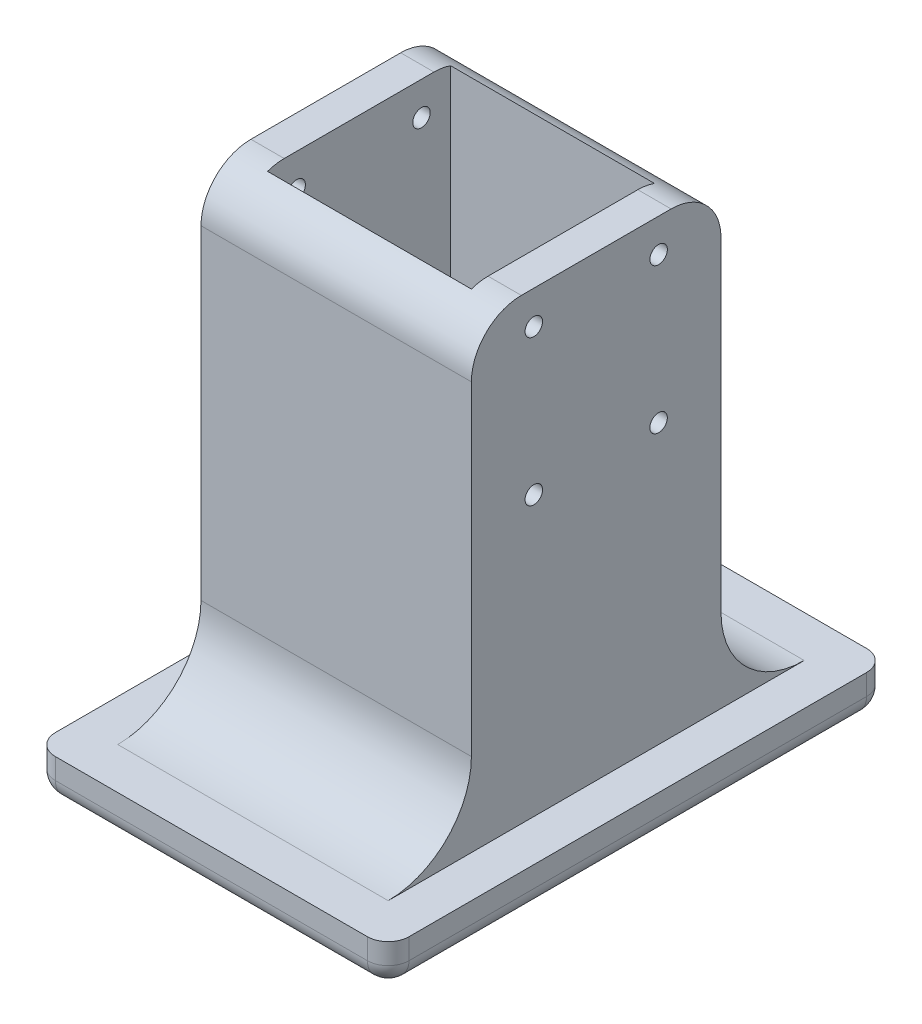
ISO-10303-21;
HEADER;
FILE_DESCRIPTION(('STEP AP214'),'2;1');
FILE_NAME('part.step','',(''),(''),'','','');
FILE_SCHEMA(('AUTOMOTIVE_DESIGN { 1 0 10303 214 1 1 1 1 }'));
ENDSEC;
DATA;
#1=APPLICATION_CONTEXT('core data for automotive mechanical design processes');
#2=APPLICATION_PROTOCOL_DEFINITION('international standard','automotive_design',2000,#1);
#3=PRODUCT_CONTEXT('',#1,'mechanical');
#4=PRODUCT('Part','Part','',(#3));
#5=PRODUCT_RELATED_PRODUCT_CATEGORY('part','',(#4));
#6=PRODUCT_DEFINITION_FORMATION('','',#4);
#7=PRODUCT_DEFINITION_CONTEXT('part definition',#1,'design');
#8=PRODUCT_DEFINITION('design','',#6,#7);
#9=PRODUCT_DEFINITION_SHAPE('','',#8);
#10=(LENGTH_UNIT() NAMED_UNIT(*) SI_UNIT(.MILLI.,.METRE.));
#11=(NAMED_UNIT(*) PLANE_ANGLE_UNIT() SI_UNIT($,.RADIAN.));
#12=(NAMED_UNIT(*) SI_UNIT($,.STERADIAN.) SOLID_ANGLE_UNIT());
#13=UNCERTAINTY_MEASURE_WITH_UNIT(LENGTH_MEASURE(1.E-05),#10,'distance_accuracy_value','');
#14=(GEOMETRIC_REPRESENTATION_CONTEXT(3) GLOBAL_UNCERTAINTY_ASSIGNED_CONTEXT((#13)) GLOBAL_UNIT_ASSIGNED_CONTEXT((#10,
#11,#12)) REPRESENTATION_CONTEXT('',''));
#15=CARTESIAN_POINT('',(0.,0.,0.));
#16=DIRECTION('',(0.,0.,1.));
#17=DIRECTION('',(1.,0.,0.));
#18=AXIS2_PLACEMENT_3D('',#15,#16,#17);
#19=CARTESIAN_POINT('',(0.,120.,0.));
#20=DIRECTION('',(0.,1.,0.));
#21=DIRECTION('',(0.,0.,1.));
#22=AXIS2_PLACEMENT_3D('',#19,#20,#21);
#23=PLANE('',#22);
#24=DIRECTION('',(0.,0.,1.));
#25=VECTOR('',#24,1.);
#26=CARTESIAN_POINT('',(-32.5,120.,30.));
#27=LINE('',#26,#25);
#28=CARTESIAN_POINT('',(-32.5,120.,-18.));
#29=VERTEX_POINT('',#28);
#30=CARTESIAN_POINT('',(-32.5,120.,18.));
#31=VERTEX_POINT('',#30);
#32=EDGE_CURVE('E239',#29,#31,#27,.T.);
#33=ORIENTED_EDGE('',*,*,#32,.T.);
#34=DIRECTION('',(1.,0.,0.));
#35=VECTOR('',#34,1.);
#36=CARTESIAN_POINT('',(32.5,120.,18.));
#37=LINE('',#36,#35);
#38=CARTESIAN_POINT('',(-24.5,120.,18.));
#39=VERTEX_POINT('',#38);
#40=EDGE_CURVE('E356',#31,#39,#37,.T.);
#41=ORIENTED_EDGE('',*,*,#40,.T.);
#42=DIRECTION('',(0.,0.,1.));
#43=VECTOR('',#42,1.);
#44=CARTESIAN_POINT('',(-24.5,120.,22.));
#45=LINE('',#44,#43);
#46=CARTESIAN_POINT('',(-24.5,120.,-18.));
#47=VERTEX_POINT('',#46);
#48=EDGE_CURVE('E227',#47,#39,#45,.T.);
#49=ORIENTED_EDGE('',*,*,#48,.F.);
#50=DIRECTION('',(-1.,0.,0.));
#51=VECTOR('',#50,1.);
#52=CARTESIAN_POINT('',(-32.5,120.,-18.));
#53=LINE('',#52,#51);
#54=EDGE_CURVE('E313',#47,#29,#53,.T.);
#55=ORIENTED_EDGE('',*,*,#54,.T.);
#56=EDGE_LOOP('',(#33,#41,#49,#55));
#57=FACE_BOUND('',#56,.T.);
#58=ADVANCED_FACE('F41',(#57),#23,.T.);
#59=CARTESIAN_POINT('',(0.,10.,0.));
#60=DIRECTION('',(0.,1.,0.));
#61=DIRECTION('',(0.,0.,1.));
#62=AXIS2_PLACEMENT_3D('',#59,#60,#61);
#63=PLANE('',#62);
#64=DIRECTION('',(1.,0.,0.));
#65=VECTOR('',#64,1.);
#66=CARTESIAN_POINT('',(42.5,10.,60.));
#67=LINE('',#66,#65);
#68=CARTESIAN_POINT('',(-37.5,10.,60.));
#69=VERTEX_POINT('',#68);
#70=CARTESIAN_POINT('',(37.5,10.,60.));
#71=VERTEX_POINT('',#70);
#72=EDGE_CURVE('E262',#69,#71,#67,.T.);
#73=ORIENTED_EDGE('',*,*,#72,.T.);
#74=CARTESIAN_POINT('',(37.5,10.,55.));
#75=DIRECTION('',(0.,1.,0.));
#76=DIRECTION('',(0.,0.,1.));
#77=AXIS2_PLACEMENT_3D('',#74,#75,#76);
#78=CIRCLE('',#77,5.);
#79=CARTESIAN_POINT('',(42.5,10.,55.));
#80=VERTEX_POINT('',#79);
#81=EDGE_CURVE('E311',#71,#80,#78,.T.);
#82=ORIENTED_EDGE('',*,*,#81,.T.);
#83=DIRECTION('',(0.,0.,-1.));
#84=VECTOR('',#83,1.);
#85=CARTESIAN_POINT('',(42.5,10.,60.));
#86=LINE('',#85,#84);
#87=CARTESIAN_POINT('',(42.5,10.,-55.));
#88=VERTEX_POINT('',#87);
#89=EDGE_CURVE('E265',#80,#88,#86,.T.);
#90=ORIENTED_EDGE('',*,*,#89,.T.);
#91=CARTESIAN_POINT('',(37.5,10.,-55.));
#92=DIRECTION('',(0.,1.,0.));
#93=DIRECTION('',(0.,0.,1.));
#94=AXIS2_PLACEMENT_3D('',#91,#92,#93);
#95=CIRCLE('',#94,5.);
#96=CARTESIAN_POINT('',(37.5,10.,-60.));
#97=VERTEX_POINT('',#96);
#98=EDGE_CURVE('E305',#88,#97,#95,.T.);
#99=ORIENTED_EDGE('',*,*,#98,.T.);
#100=DIRECTION('',(-1.,0.,0.));
#101=VECTOR('',#100,1.);
#102=CARTESIAN_POINT('',(42.5,10.,-60.));
#103=LINE('',#102,#101);
#104=CARTESIAN_POINT('',(-37.5,10.,-60.));
#105=VERTEX_POINT('',#104);
#106=EDGE_CURVE('E268',#97,#105,#103,.T.);
#107=ORIENTED_EDGE('',*,*,#106,.T.);
#108=CARTESIAN_POINT('',(-37.5,10.,-55.));
#109=DIRECTION('',(0.,1.,0.));
#110=DIRECTION('',(0.,0.,1.));
#111=AXIS2_PLACEMENT_3D('',#108,#109,#110);
#112=CIRCLE('',#111,5.);
#113=CARTESIAN_POINT('',(-42.5,10.,-55.));
#114=VERTEX_POINT('',#113);
#115=EDGE_CURVE('E307',#105,#114,#112,.T.);
#116=ORIENTED_EDGE('',*,*,#115,.T.);
#117=DIRECTION('',(0.,0.,1.));
#118=VECTOR('',#117,1.);
#119=CARTESIAN_POINT('',(-42.5,10.,60.));
#120=LINE('',#119,#118);
#121=CARTESIAN_POINT('',(-42.5,10.,55.));
#122=VERTEX_POINT('',#121);
#123=EDGE_CURVE('E259',#114,#122,#120,.T.);
#124=ORIENTED_EDGE('',*,*,#123,.T.);
#125=CARTESIAN_POINT('',(-37.5,10.,55.));
#126=DIRECTION('',(0.,1.,0.));
#127=DIRECTION('',(0.,0.,1.));
#128=AXIS2_PLACEMENT_3D('',#125,#126,#127);
#129=CIRCLE('',#128,5.);
#130=EDGE_CURVE('E309',#122,#69,#129,.T.);
#131=ORIENTED_EDGE('',*,*,#130,.T.);
#132=EDGE_LOOP('',(#73,#82,#90,#99,#107,#116,#124,#131));
#133=FACE_BOUND('',#132,.T.);
#134=DIRECTION('',(0.,0.,1.));
#135=VECTOR('',#134,1.);
#136=CARTESIAN_POINT('',(-32.5,10.,30.));
#137=LINE('',#136,#135);
#138=CARTESIAN_POINT('',(-32.5,10.,-50.));
#139=VERTEX_POINT('',#138);
#140=CARTESIAN_POINT('',(-32.5,10.,50.));
#141=VERTEX_POINT('',#140);
#142=EDGE_CURVE('E238',#139,#141,#137,.T.);
#143=ORIENTED_EDGE('',*,*,#142,.F.);
#144=DIRECTION('',(-1.,0.,0.));
#145=VECTOR('',#144,1.);
#146=CARTESIAN_POINT('',(0.,10.,-50.));
#147=LINE('',#146,#145);
#148=CARTESIAN_POINT('',(32.5,10.,-50.));
#149=VERTEX_POINT('',#148);
#150=EDGE_CURVE('E407',#139,#149,#147,.F.);
#151=ORIENTED_EDGE('',*,*,#150,.T.);
#152=DIRECTION('',(0.,0.,-1.));
#153=VECTOR('',#152,1.);
#154=CARTESIAN_POINT('',(32.5,10.,30.));
#155=LINE('',#154,#153);
#156=CARTESIAN_POINT('',(32.5,10.,50.));
#157=VERTEX_POINT('',#156);
#158=EDGE_CURVE('E243',#157,#149,#155,.T.);
#159=ORIENTED_EDGE('',*,*,#158,.F.);
#160=DIRECTION('',(1.,0.,0.));
#161=VECTOR('',#160,1.);
#162=CARTESIAN_POINT('',(0.,10.,50.));
#163=LINE('',#162,#161);
#164=EDGE_CURVE('E404',#157,#141,#163,.F.);
#165=ORIENTED_EDGE('',*,*,#164,.T.);
#166=EDGE_LOOP('',(#143,#151,#159,#165));
#167=FACE_BOUND('',#166,.T.);
#168=ADVANCED_FACE('F421',(#133,#167),#63,.T.);
#169=CARTESIAN_POINT('',(-42.5,10.,60.));
#170=DIRECTION('',(1.,0.,0.));
#171=DIRECTION('',(0.,0.,-1.));
#172=AXIS2_PLACEMENT_3D('',#169,#170,#171);
#173=PLANE('',#172);
#174=DIRECTION('',(0.,0.,1.));
#175=VECTOR('',#174,1.);
#176=CARTESIAN_POINT('',(-42.5,5.,60.));
#177=LINE('',#176,#175);
#178=CARTESIAN_POINT('',(-42.5,5.,-55.));
#179=VERTEX_POINT('',#178);
#180=CARTESIAN_POINT('',(-42.5,5.,55.));
#181=VERTEX_POINT('',#180);
#182=EDGE_CURVE('E301',#179,#181,#177,.T.);
#183=ORIENTED_EDGE('',*,*,#182,.T.);
#184=DIRECTION('',(0.,-1.,0.));
#185=VECTOR('',#184,1.);
#186=CARTESIAN_POINT('',(-42.5,10.,55.));
#187=LINE('',#186,#185);
#188=EDGE_CURVE('E303',#181,#122,#187,.F.);
#189=ORIENTED_EDGE('',*,*,#188,.T.);
#190=ORIENTED_EDGE('',*,*,#123,.F.);
#191=DIRECTION('',(0.,-1.,0.));
#192=VECTOR('',#191,1.);
#193=CARTESIAN_POINT('',(-42.5,10.,-55.));
#194=LINE('',#193,#192);
#195=EDGE_CURVE('E299',#114,#179,#194,.T.);
#196=ORIENTED_EDGE('',*,*,#195,.T.);
#197=EDGE_LOOP('',(#183,#189,#190,#196));
#198=FACE_BOUND('',#197,.T.);
#199=ADVANCED_FACE('F513',(#198),#173,.F.);
#200=CARTESIAN_POINT('',(42.5,10.,60.));
#201=DIRECTION('',(0.,0.,-1.));
#202=DIRECTION('',(-1.,0.,0.));
#203=AXIS2_PLACEMENT_3D('',#200,#201,#202);
#204=PLANE('',#203);
#205=DIRECTION('',(1.,0.,0.));
#206=VECTOR('',#205,1.);
#207=CARTESIAN_POINT('',(42.5,5.,60.));
#208=LINE('',#207,#206);
#209=CARTESIAN_POINT('',(-37.5,5.,60.));
#210=VERTEX_POINT('',#209);
#211=CARTESIAN_POINT('',(37.5,5.,60.));
#212=VERTEX_POINT('',#211);
#213=EDGE_CURVE('E273',#210,#212,#208,.T.);
#214=ORIENTED_EDGE('',*,*,#213,.T.);
#215=DIRECTION('',(0.,-1.,0.));
#216=VECTOR('',#215,1.);
#217=CARTESIAN_POINT('',(37.5,10.,60.));
#218=LINE('',#217,#216);
#219=EDGE_CURVE('E276',#212,#71,#218,.F.);
#220=ORIENTED_EDGE('',*,*,#219,.T.);
#221=ORIENTED_EDGE('',*,*,#72,.F.);
#222=DIRECTION('',(0.,-1.,0.));
#223=VECTOR('',#222,1.);
#224=CARTESIAN_POINT('',(-37.5,10.,60.));
#225=LINE('',#224,#223);
#226=EDGE_CURVE('E271',#69,#210,#225,.T.);
#227=ORIENTED_EDGE('',*,*,#226,.T.);
#228=EDGE_LOOP('',(#214,#220,#221,#227));
#229=FACE_BOUND('',#228,.T.);
#230=ADVANCED_FACE('F536',(#229),#204,.F.);
#231=CARTESIAN_POINT('',(42.5,10.,60.));
#232=DIRECTION('',(-1.,0.,0.));
#233=DIRECTION('',(0.,0.,1.));
#234=AXIS2_PLACEMENT_3D('',#231,#232,#233);
#235=PLANE('',#234);
#236=ORIENTED_EDGE('',*,*,#89,.F.);
#237=DIRECTION('',(0.,-1.,0.));
#238=VECTOR('',#237,1.);
#239=CARTESIAN_POINT('',(42.5,10.,55.));
#240=LINE('',#239,#238);
#241=CARTESIAN_POINT('',(42.5,5.,55.));
#242=VERTEX_POINT('',#241);
#243=EDGE_CURVE('E291',#80,#242,#240,.T.);
#244=ORIENTED_EDGE('',*,*,#243,.T.);
#245=DIRECTION('',(0.,0.,-1.));
#246=VECTOR('',#245,1.);
#247=CARTESIAN_POINT('',(42.5,5.,60.));
#248=LINE('',#247,#246);
#249=CARTESIAN_POINT('',(42.5,5.,-55.));
#250=VERTEX_POINT('',#249);
#251=EDGE_CURVE('E289',#242,#250,#248,.T.);
#252=ORIENTED_EDGE('',*,*,#251,.T.);
#253=DIRECTION('',(0.,-1.,0.));
#254=VECTOR('',#253,1.);
#255=CARTESIAN_POINT('',(42.5,10.,-55.));
#256=LINE('',#255,#254);
#257=EDGE_CURVE('E287',#250,#88,#256,.F.);
#258=ORIENTED_EDGE('',*,*,#257,.T.);
#259=EDGE_LOOP('',(#236,#244,#252,#258));
#260=FACE_BOUND('',#259,.T.);
#261=ADVANCED_FACE('F530',(#260),#235,.F.);
#262=CARTESIAN_POINT('',(42.5,10.,-60.));
#263=DIRECTION('',(0.,0.,1.));
#264=DIRECTION('',(1.,0.,0.));
#265=AXIS2_PLACEMENT_3D('',#262,#263,#264);
#266=PLANE('',#265);
#267=DIRECTION('',(-1.,0.,0.));
#268=VECTOR('',#267,1.);
#269=CARTESIAN_POINT('',(42.5,5.,-60.));
#270=LINE('',#269,#268);
#271=CARTESIAN_POINT('',(37.5,5.,-60.));
#272=VERTEX_POINT('',#271);
#273=CARTESIAN_POINT('',(-37.5,5.,-60.));
#274=VERTEX_POINT('',#273);
#275=EDGE_CURVE('E295',#272,#274,#270,.T.);
#276=ORIENTED_EDGE('',*,*,#275,.T.);
#277=DIRECTION('',(0.,-1.,0.));
#278=VECTOR('',#277,1.);
#279=CARTESIAN_POINT('',(-37.5,10.,-60.));
#280=LINE('',#279,#278);
#281=EDGE_CURVE('E297',#274,#105,#280,.F.);
#282=ORIENTED_EDGE('',*,*,#281,.T.);
#283=ORIENTED_EDGE('',*,*,#106,.F.);
#284=DIRECTION('',(0.,-1.,0.));
#285=VECTOR('',#284,1.);
#286=CARTESIAN_POINT('',(37.5,10.,-60.));
#287=LINE('',#286,#285);
#288=EDGE_CURVE('E293',#97,#272,#287,.T.);
#289=ORIENTED_EDGE('',*,*,#288,.T.);
#290=EDGE_LOOP('',(#276,#282,#283,#289));
#291=FACE_BOUND('',#290,.T.);
#292=ADVANCED_FACE('F524',(#291),#266,.F.);
#293=CARTESIAN_POINT('',(0.,0.,0.));
#294=DIRECTION('',(0.,1.,0.));
#295=DIRECTION('',(0.,0.,1.));
#296=AXIS2_PLACEMENT_3D('',#293,#294,#295);
#297=PLANE('',#296);
#298=DIRECTION('',(0.,0.,-1.));
#299=VECTOR('',#298,1.);
#300=CARTESIAN_POINT('',(37.5,0.,0.));
#301=LINE('',#300,#299);
#302=CARTESIAN_POINT('',(37.5,0.,-55.));
#303=VERTEX_POINT('',#302);
#304=CARTESIAN_POINT('',(37.5,0.,55.));
#305=VERTEX_POINT('',#304);
#306=EDGE_CURVE('E282',#303,#305,#301,.F.);
#307=ORIENTED_EDGE('',*,*,#306,.T.);
#308=DIRECTION('',(1.,0.,0.));
#309=VECTOR('',#308,1.);
#310=CARTESIAN_POINT('',(0.,0.,55.));
#311=LINE('',#310,#309);
#312=CARTESIAN_POINT('',(-37.5,0.,55.));
#313=VERTEX_POINT('',#312);
#314=EDGE_CURVE('E284',#305,#313,#311,.F.);
#315=ORIENTED_EDGE('',*,*,#314,.T.);
#316=DIRECTION('',(0.,0.,1.));
#317=VECTOR('',#316,1.);
#318=CARTESIAN_POINT('',(-37.5,0.,0.));
#319=LINE('',#318,#317);
#320=CARTESIAN_POINT('',(-37.5,0.,-55.));
#321=VERTEX_POINT('',#320);
#322=EDGE_CURVE('E278',#313,#321,#319,.F.);
#323=ORIENTED_EDGE('',*,*,#322,.T.);
#324=DIRECTION('',(-1.,0.,0.));
#325=VECTOR('',#324,1.);
#326=CARTESIAN_POINT('',(0.,0.,-55.));
#327=LINE('',#326,#325);
#328=EDGE_CURVE('E280',#321,#303,#327,.F.);
#329=ORIENTED_EDGE('',*,*,#328,.T.);
#330=EDGE_LOOP('',(#307,#315,#323,#329));
#331=FACE_BOUND('',#330,.T.);
#332=ADVANCED_FACE('F517',(#331),#297,.F.);
#333=DIRECTION('',(0.,0.,-1.));
#334=VECTOR('',#333,1.);
#335=CARTESIAN_POINT('',(24.5,120.,22.));
#336=LINE('',#335,#334);
#337=CARTESIAN_POINT('',(24.5,120.,18.));
#338=VERTEX_POINT('',#337);
#339=CARTESIAN_POINT('',(24.5,120.,-18.));
#340=VERTEX_POINT('',#339);
#341=EDGE_CURVE('E230',#338,#340,#336,.T.);
#342=ORIENTED_EDGE('',*,*,#341,.F.);
#343=DIRECTION('',(1.,0.,0.));
#344=VECTOR('',#343,1.);
#345=CARTESIAN_POINT('',(32.5,120.,18.));
#346=LINE('',#345,#344);
#347=CARTESIAN_POINT('',(32.5,120.,18.));
#348=VERTEX_POINT('',#347);
#349=EDGE_CURVE('E354',#338,#348,#346,.T.);
#350=ORIENTED_EDGE('',*,*,#349,.T.);
#351=DIRECTION('',(0.,0.,-1.));
#352=VECTOR('',#351,1.);
#353=CARTESIAN_POINT('',(32.5,120.,30.));
#354=LINE('',#353,#352);
#355=CARTESIAN_POINT('',(32.5,120.,-18.));
#356=VERTEX_POINT('',#355);
#357=EDGE_CURVE('E242',#348,#356,#354,.T.);
#358=ORIENTED_EDGE('',*,*,#357,.T.);
#359=DIRECTION('',(-1.,0.,0.));
#360=VECTOR('',#359,1.);
#361=CARTESIAN_POINT('',(-32.5,120.,-18.));
#362=LINE('',#361,#360);
#363=EDGE_CURVE('E351',#356,#340,#362,.T.);
#364=ORIENTED_EDGE('',*,*,#363,.T.);
#365=EDGE_LOOP('',(#342,#350,#358,#364));
#366=FACE_BOUND('',#365,.T.);
#367=ADVANCED_FACE('F441',(#366),#23,.T.);
#368=CARTESIAN_POINT('',(-32.5,120.,30.));
#369=DIRECTION('',(1.,0.,0.));
#370=DIRECTION('',(0.,0.,-1.));
#371=AXIS2_PLACEMENT_3D('',#368,#369,#370);
#372=PLANE('',#371);
#373=CARTESIAN_POINT('',(-32.5,77.,15.));
#374=DIRECTION('',(1.,0.,0.));
#375=DIRECTION('',(0.,0.,-1.));
#376=AXIS2_PLACEMENT_3D('',#373,#374,#375);
#377=CIRCLE('',#376,2.1);
#378=CARTESIAN_POINT('',(-32.5,77.,12.9));
#379=VERTEX_POINT('',#378);
#380=EDGE_CURVE('E317',#379,#379,#377,.T.);
#381=ORIENTED_EDGE('',*,*,#380,.T.);
#382=EDGE_LOOP('',(#381));
#383=FACE_BOUND('',#382,.T.);
#384=CARTESIAN_POINT('',(-32.5,77.,-15.));
#385=DIRECTION('',(1.,0.,0.));
#386=DIRECTION('',(0.,0.,-1.));
#387=AXIS2_PLACEMENT_3D('',#384,#385,#386);
#388=CIRCLE('',#387,2.1);
#389=CARTESIAN_POINT('',(-32.5,77.,-17.1));
#390=VERTEX_POINT('',#389);
#391=EDGE_CURVE('E401',#390,#390,#388,.T.);
#392=ORIENTED_EDGE('',*,*,#391,.T.);
#393=EDGE_LOOP('',(#392));
#394=FACE_BOUND('',#393,.T.);
#395=CARTESIAN_POINT('',(-32.5,112.,-15.));
#396=DIRECTION('',(1.,0.,0.));
#397=DIRECTION('',(0.,0.,-1.));
#398=AXIS2_PLACEMENT_3D('',#395,#396,#397);
#399=CIRCLE('',#398,2.1);
#400=CARTESIAN_POINT('',(-32.5,112.,-17.1));
#401=VERTEX_POINT('',#400);
#402=EDGE_CURVE('E396',#401,#401,#399,.T.);
#403=ORIENTED_EDGE('',*,*,#402,.T.);
#404=EDGE_LOOP('',(#403));
#405=FACE_BOUND('',#404,.T.);
#406=CARTESIAN_POINT('',(-32.5,112.,15.));
#407=DIRECTION('',(1.,0.,0.));
#408=DIRECTION('',(0.,0.,-1.));
#409=AXIS2_PLACEMENT_3D('',#406,#407,#408);
#410=CIRCLE('',#409,2.1);
#411=CARTESIAN_POINT('',(-32.5,112.,12.9));
#412=VERTEX_POINT('',#411);
#413=EDGE_CURVE('E391',#412,#412,#410,.T.);
#414=ORIENTED_EDGE('',*,*,#413,.T.);
#415=EDGE_LOOP('',(#414));
#416=FACE_BOUND('',#415,.T.);
#417=DIRECTION('',(0.,-1.,0.));
#418=VECTOR('',#417,1.);
#419=CARTESIAN_POINT('',(-32.5,120.,30.));
#420=LINE('',#419,#418);
#421=CARTESIAN_POINT('',(-32.5,108.,30.));
#422=VERTEX_POINT('',#421);
#423=CARTESIAN_POINT('',(-32.5,30.,30.));
#424=VERTEX_POINT('',#423);
#425=EDGE_CURVE('E257',#422,#424,#420,.T.);
#426=ORIENTED_EDGE('',*,*,#425,.F.);
#427=CARTESIAN_POINT('',(-32.5,108.,18.));
#428=DIRECTION('',(1.,0.,0.));
#429=DIRECTION('',(0.,0.,-1.));
#430=AXIS2_PLACEMENT_3D('',#427,#428,#429);
#431=CIRCLE('',#430,12.);
#432=EDGE_CURVE('E376',#422,#31,#431,.F.);
#433=ORIENTED_EDGE('',*,*,#432,.T.);
#434=ORIENTED_EDGE('',*,*,#32,.F.);
#435=CARTESIAN_POINT('',(-32.5,108.,-18.));
#436=DIRECTION('',(1.,0.,0.));
#437=DIRECTION('',(0.,0.,-1.));
#438=AXIS2_PLACEMENT_3D('',#435,#436,#437);
#439=CIRCLE('',#438,12.);
#440=CARTESIAN_POINT('',(-32.5,108.,-30.));
#441=VERTEX_POINT('',#440);
#442=EDGE_CURVE('E374',#29,#441,#439,.F.);
#443=ORIENTED_EDGE('',*,*,#442,.T.);
#444=DIRECTION('',(0.,-1.,0.));
#445=VECTOR('',#444,1.);
#446=CARTESIAN_POINT('',(-32.5,120.,-30.));
#447=LINE('',#446,#445);
#448=CARTESIAN_POINT('',(-32.5,30.,-30.));
#449=VERTEX_POINT('',#448);
#450=EDGE_CURVE('E246',#441,#449,#447,.T.);
#451=ORIENTED_EDGE('',*,*,#450,.T.);
#452=CARTESIAN_POINT('',(-32.5,30.,-50.));
#453=DIRECTION('',(1.,0.,0.));
#454=DIRECTION('',(0.,0.,-1.));
#455=AXIS2_PLACEMENT_3D('',#452,#453,#454);
#456=CIRCLE('',#455,20.);
#457=EDGE_CURVE('E412',#449,#139,#456,.T.);
#458=ORIENTED_EDGE('',*,*,#457,.T.);
#459=ORIENTED_EDGE('',*,*,#142,.T.);
#460=CARTESIAN_POINT('',(-32.5,30.,50.));
#461=DIRECTION('',(1.,0.,0.));
#462=DIRECTION('',(0.,0.,-1.));
#463=AXIS2_PLACEMENT_3D('',#460,#461,#462);
#464=CIRCLE('',#463,20.);
#465=EDGE_CURVE('E11',#141,#424,#464,.T.);
#466=ORIENTED_EDGE('',*,*,#465,.T.);
#467=EDGE_LOOP('',(#426,#433,#434,#443,#451,#458,#459,#466));
#468=FACE_BOUND('',#467,.T.);
#469=ADVANCED_FACE('F451',(#383,#394,#405,#416,#468),#372,.F.);
#470=CARTESIAN_POINT('',(32.5,120.,30.));
#471=DIRECTION('',(0.,0.,-1.));
#472=DIRECTION('',(-1.,0.,0.));
#473=AXIS2_PLACEMENT_3D('',#470,#471,#472);
#474=PLANE('',#473);
#475=ORIENTED_EDGE('',*,*,#425,.T.);
#476=DIRECTION('',(1.,0.,0.));
#477=VECTOR('',#476,1.);
#478=CARTESIAN_POINT('',(32.5,30.,30.));
#479=LINE('',#478,#477);
#480=CARTESIAN_POINT('',(32.5,30.,30.));
#481=VERTEX_POINT('',#480);
#482=EDGE_CURVE('E410',#424,#481,#479,.T.);
#483=ORIENTED_EDGE('',*,*,#482,.T.);
#484=DIRECTION('',(0.,-1.,0.));
#485=VECTOR('',#484,1.);
#486=CARTESIAN_POINT('',(32.5,120.,30.));
#487=LINE('',#486,#485);
#488=CARTESIAN_POINT('',(32.5,108.,30.));
#489=VERTEX_POINT('',#488);
#490=EDGE_CURVE('E254',#489,#481,#487,.T.);
#491=ORIENTED_EDGE('',*,*,#490,.F.);
#492=DIRECTION('',(1.,0.,0.));
#493=VECTOR('',#492,1.);
#494=CARTESIAN_POINT('',(-32.5,108.,30.));
#495=LINE('',#494,#493);
#496=EDGE_CURVE('E372',#489,#422,#495,.F.);
#497=ORIENTED_EDGE('',*,*,#496,.T.);
#498=EDGE_LOOP('',(#475,#483,#491,#497));
#499=FACE_BOUND('',#498,.T.);
#500=ADVANCED_FACE('F450',(#499),#474,.F.);
#501=CARTESIAN_POINT('',(32.5,120.,30.));
#502=DIRECTION('',(-1.,0.,0.));
#503=DIRECTION('',(0.,0.,1.));
#504=AXIS2_PLACEMENT_3D('',#501,#502,#503);
#505=PLANE('',#504);
#506=CARTESIAN_POINT('',(32.5,77.,15.));
#507=DIRECTION('',(-1.,0.,0.));
#508=DIRECTION('',(0.,0.,1.));
#509=AXIS2_PLACEMENT_3D('',#506,#507,#508);
#510=CIRCLE('',#509,2.1);
#511=CARTESIAN_POINT('',(32.5,77.,17.1));
#512=VERTEX_POINT('',#511);
#513=EDGE_CURVE('E465',#512,#512,#510,.T.);
#514=ORIENTED_EDGE('',*,*,#513,.T.);
#515=EDGE_LOOP('',(#514));
#516=FACE_BOUND('',#515,.T.);
#517=CARTESIAN_POINT('',(32.5,77.,-15.));
#518=DIRECTION('',(-1.,0.,0.));
#519=DIRECTION('',(0.,0.,1.));
#520=AXIS2_PLACEMENT_3D('',#517,#518,#519);
#521=CIRCLE('',#520,2.1);
#522=CARTESIAN_POINT('',(32.5,77.,-12.9));
#523=VERTEX_POINT('',#522);
#524=EDGE_CURVE('E472',#523,#523,#521,.T.);
#525=ORIENTED_EDGE('',*,*,#524,.T.);
#526=EDGE_LOOP('',(#525));
#527=FACE_BOUND('',#526,.T.);
#528=CARTESIAN_POINT('',(32.5,112.,-15.));
#529=DIRECTION('',(-1.,0.,0.));
#530=DIRECTION('',(0.,0.,1.));
#531=AXIS2_PLACEMENT_3D('',#528,#529,#530);
#532=CIRCLE('',#531,2.1);
#533=CARTESIAN_POINT('',(32.5,112.,-12.9));
#534=VERTEX_POINT('',#533);
#535=EDGE_CURVE('E479',#534,#534,#532,.T.);
#536=ORIENTED_EDGE('',*,*,#535,.T.);
#537=EDGE_LOOP('',(#536));
#538=FACE_BOUND('',#537,.T.);
#539=CARTESIAN_POINT('',(32.5,112.,15.));
#540=DIRECTION('',(-1.,0.,0.));
#541=DIRECTION('',(0.,0.,1.));
#542=AXIS2_PLACEMENT_3D('',#539,#540,#541);
#543=CIRCLE('',#542,2.1);
#544=CARTESIAN_POINT('',(32.5,112.,17.1));
#545=VERTEX_POINT('',#544);
#546=EDGE_CURVE('E486',#545,#545,#543,.T.);
#547=ORIENTED_EDGE('',*,*,#546,.T.);
#548=EDGE_LOOP('',(#547));
#549=FACE_BOUND('',#548,.T.);
#550=ORIENTED_EDGE('',*,*,#357,.F.);
#551=CARTESIAN_POINT('',(32.5,108.,18.));
#552=DIRECTION('',(-1.,0.,0.));
#553=DIRECTION('',(0.,0.,1.));
#554=AXIS2_PLACEMENT_3D('',#551,#552,#553);
#555=CIRCLE('',#554,12.);
#556=EDGE_CURVE('E370',#348,#489,#555,.F.);
#557=ORIENTED_EDGE('',*,*,#556,.T.);
#558=ORIENTED_EDGE('',*,*,#490,.T.);
#559=CARTESIAN_POINT('',(32.5,30.,50.));
#560=DIRECTION('',(-1.,0.,0.));
#561=DIRECTION('',(0.,0.,1.));
#562=AXIS2_PLACEMENT_3D('',#559,#560,#561);
#563=CIRCLE('',#562,20.);
#564=EDGE_CURVE('E49',#481,#157,#563,.T.);
#565=ORIENTED_EDGE('',*,*,#564,.T.);
#566=ORIENTED_EDGE('',*,*,#158,.T.);
#567=CARTESIAN_POINT('',(32.5,30.,-50.));
#568=DIRECTION('',(-1.,0.,0.));
#569=DIRECTION('',(0.,0.,1.));
#570=AXIS2_PLACEMENT_3D('',#567,#568,#569);
#571=CIRCLE('',#570,20.);
#572=CARTESIAN_POINT('',(32.5,30.,-30.));
#573=VERTEX_POINT('',#572);
#574=EDGE_CURVE('E415',#149,#573,#571,.T.);
#575=ORIENTED_EDGE('',*,*,#574,.T.);
#576=DIRECTION('',(0.,-1.,0.));
#577=VECTOR('',#576,1.);
#578=CARTESIAN_POINT('',(32.5,120.,-30.));
#579=LINE('',#578,#577);
#580=CARTESIAN_POINT('',(32.5,108.,-30.));
#581=VERTEX_POINT('',#580);
#582=EDGE_CURVE('E251',#581,#573,#579,.T.);
#583=ORIENTED_EDGE('',*,*,#582,.F.);
#584=CARTESIAN_POINT('',(32.5,108.,-18.));
#585=DIRECTION('',(-1.,0.,0.));
#586=DIRECTION('',(0.,0.,1.));
#587=AXIS2_PLACEMENT_3D('',#584,#585,#586);
#588=CIRCLE('',#587,12.);
#589=EDGE_CURVE('E368',#581,#356,#588,.F.);
#590=ORIENTED_EDGE('',*,*,#589,.T.);
#591=EDGE_LOOP('',(#550,#557,#558,#565,#566,#575,#583,#590));
#592=FACE_BOUND('',#591,.T.);
#593=ADVANCED_FACE('F418',(#516,#527,#538,#549,#592),#505,.F.);
#594=CARTESIAN_POINT('',(32.5,120.,-30.));
#595=DIRECTION('',(0.,0.,1.));
#596=DIRECTION('',(1.,0.,0.));
#597=AXIS2_PLACEMENT_3D('',#594,#595,#596);
#598=PLANE('',#597);
#599=ORIENTED_EDGE('',*,*,#582,.T.);
#600=DIRECTION('',(-1.,0.,0.));
#601=VECTOR('',#600,1.);
#602=CARTESIAN_POINT('',(32.5,30.,-30.));
#603=LINE('',#602,#601);
#604=EDGE_CURVE('E382',#573,#449,#603,.T.);
#605=ORIENTED_EDGE('',*,*,#604,.T.);
#606=ORIENTED_EDGE('',*,*,#450,.F.);
#607=DIRECTION('',(-1.,0.,0.));
#608=VECTOR('',#607,1.);
#609=CARTESIAN_POINT('',(32.5,108.,-30.));
#610=LINE('',#609,#608);
#611=EDGE_CURVE('E380',#441,#581,#610,.F.);
#612=ORIENTED_EDGE('',*,*,#611,.T.);
#613=EDGE_LOOP('',(#599,#605,#606,#612));
#614=FACE_BOUND('',#613,.T.);
#615=ADVANCED_FACE('F430',(#614),#598,.F.);
#616=CARTESIAN_POINT('',(-24.5,120.,22.));
#617=DIRECTION('',(1.,0.,0.));
#618=DIRECTION('',(0.,0.,-1.));
#619=AXIS2_PLACEMENT_3D('',#616,#617,#618);
#620=PLANE('',#619);
#621=CARTESIAN_POINT('',(-24.5,77.,15.));
#622=DIRECTION('',(1.,0.,0.));
#623=DIRECTION('',(0.,0.,-1.));
#624=AXIS2_PLACEMENT_3D('',#621,#622,#623);
#625=CIRCLE('',#624,2.1);
#626=CARTESIAN_POINT('',(-24.5,77.,12.9));
#627=VERTEX_POINT('',#626);
#628=EDGE_CURVE('E400',#627,#627,#625,.T.);
#629=ORIENTED_EDGE('',*,*,#628,.F.);
#630=EDGE_LOOP('',(#629));
#631=FACE_BOUND('',#630,.T.);
#632=CARTESIAN_POINT('',(-24.5,77.,-15.));
#633=DIRECTION('',(1.,0.,0.));
#634=DIRECTION('',(0.,0.,-1.));
#635=AXIS2_PLACEMENT_3D('',#632,#633,#634);
#636=CIRCLE('',#635,2.1);
#637=CARTESIAN_POINT('',(-24.5,77.,-17.1));
#638=VERTEX_POINT('',#637);
#639=EDGE_CURVE('E395',#638,#638,#636,.T.);
#640=ORIENTED_EDGE('',*,*,#639,.F.);
#641=EDGE_LOOP('',(#640));
#642=FACE_BOUND('',#641,.T.);
#643=CARTESIAN_POINT('',(-24.5,112.,-15.));
#644=DIRECTION('',(1.,0.,0.));
#645=DIRECTION('',(0.,0.,-1.));
#646=AXIS2_PLACEMENT_3D('',#643,#644,#645);
#647=CIRCLE('',#646,2.1);
#648=CARTESIAN_POINT('',(-24.5,112.,-17.1));
#649=VERTEX_POINT('',#648);
#650=EDGE_CURVE('E390',#649,#649,#647,.T.);
#651=ORIENTED_EDGE('',*,*,#650,.F.);
#652=EDGE_LOOP('',(#651));
#653=FACE_BOUND('',#652,.T.);
#654=CARTESIAN_POINT('',(-24.5,112.,15.));
#655=DIRECTION('',(1.,0.,0.));
#656=DIRECTION('',(0.,0.,-1.));
#657=AXIS2_PLACEMENT_3D('',#654,#655,#656);
#658=CIRCLE('',#657,2.1);
#659=CARTESIAN_POINT('',(-24.5,112.,12.9));
#660=VERTEX_POINT('',#659);
#661=EDGE_CURVE('E386',#660,#660,#658,.T.);
#662=ORIENTED_EDGE('',*,*,#661,.F.);
#663=EDGE_LOOP('',(#662));
#664=FACE_BOUND('',#663,.T.);
#665=ORIENTED_EDGE('',*,*,#48,.T.);
#666=CARTESIAN_POINT('',(-24.5,108.,18.));
#667=DIRECTION('',(1.,0.,0.));
#668=DIRECTION('',(0.,0.,-1.));
#669=AXIS2_PLACEMENT_3D('',#666,#667,#668);
#670=CIRCLE('',#669,12.);
#671=CARTESIAN_POINT('',(-24.5,119.313708498985,22.));
#672=VERTEX_POINT('',#671);
#673=EDGE_CURVE('E361',#39,#672,#670,.T.);
#674=ORIENTED_EDGE('',*,*,#673,.T.);
#675=DIRECTION('',(0.,-1.,0.));
#676=VECTOR('',#675,1.);
#677=CARTESIAN_POINT('',(-24.5,120.,22.));
#678=LINE('',#677,#676);
#679=CARTESIAN_POINT('',(-24.5,10.,22.));
#680=VERTEX_POINT('',#679);
#681=EDGE_CURVE('E236',#672,#680,#678,.T.);
#682=ORIENTED_EDGE('',*,*,#681,.T.);
#683=DIRECTION('',(0.,0.,1.));
#684=VECTOR('',#683,1.);
#685=CARTESIAN_POINT('',(-24.5,10.,22.));
#686=LINE('',#685,#684);
#687=CARTESIAN_POINT('',(-24.5,10.,-22.));
#688=VERTEX_POINT('',#687);
#689=EDGE_CURVE('E349',#688,#680,#686,.T.);
#690=ORIENTED_EDGE('',*,*,#689,.F.);
#691=DIRECTION('',(0.,-1.,0.));
#692=VECTOR('',#691,1.);
#693=CARTESIAN_POINT('',(-24.5,120.,-22.));
#694=LINE('',#693,#692);
#695=CARTESIAN_POINT('',(-24.5,119.313708498985,-22.));
#696=VERTEX_POINT('',#695);
#697=EDGE_CURVE('E213',#696,#688,#694,.T.);
#698=ORIENTED_EDGE('',*,*,#697,.F.);
#699=CARTESIAN_POINT('',(-24.5,108.,-18.));
#700=DIRECTION('',(1.,0.,0.));
#701=DIRECTION('',(0.,0.,-1.));
#702=AXIS2_PLACEMENT_3D('',#699,#700,#701);
#703=CIRCLE('',#702,12.);
#704=EDGE_CURVE('E359',#696,#47,#703,.T.);
#705=ORIENTED_EDGE('',*,*,#704,.T.);
#706=EDGE_LOOP('',(#665,#674,#682,#690,#698,#705));
#707=FACE_BOUND('',#706,.T.);
#708=ADVANCED_FACE('F457',(#631,#642,#653,#664,#707),#620,.T.);
#709=CARTESIAN_POINT('',(24.5,120.,22.));
#710=DIRECTION('',(0.,0.,-1.));
#711=DIRECTION('',(-1.,0.,0.));
#712=AXIS2_PLACEMENT_3D('',#709,#710,#711);
#713=PLANE('',#712);
#714=ORIENTED_EDGE('',*,*,#681,.F.);
#715=DIRECTION('',(-1.,0.,0.));
#716=VECTOR('',#715,1.);
#717=CARTESIAN_POINT('',(-24.5,119.313708498985,22.));
#718=LINE('',#717,#716);
#719=CARTESIAN_POINT('',(24.5,119.313708498985,22.));
#720=VERTEX_POINT('',#719);
#721=EDGE_CURVE('E363',#672,#720,#718,.F.);
#722=ORIENTED_EDGE('',*,*,#721,.T.);
#723=DIRECTION('',(0.,-1.,0.));
#724=VECTOR('',#723,1.);
#725=CARTESIAN_POINT('',(24.5,120.,22.));
#726=LINE('',#725,#724);
#727=CARTESIAN_POINT('',(24.5,10.,22.));
#728=VERTEX_POINT('',#727);
#729=EDGE_CURVE('E212',#720,#728,#726,.T.);
#730=ORIENTED_EDGE('',*,*,#729,.T.);
#731=DIRECTION('',(1.,0.,0.));
#732=VECTOR('',#731,1.);
#733=CARTESIAN_POINT('',(24.5,10.,22.));
#734=LINE('',#733,#732);
#735=EDGE_CURVE('E223',#680,#728,#734,.T.);
#736=ORIENTED_EDGE('',*,*,#735,.F.);
#737=EDGE_LOOP('',(#714,#722,#730,#736));
#738=FACE_BOUND('',#737,.T.);
#739=ADVANCED_FACE('F496',(#738),#713,.T.);
#740=CARTESIAN_POINT('',(24.5,120.,22.));
#741=DIRECTION('',(-1.,0.,0.));
#742=DIRECTION('',(0.,0.,1.));
#743=AXIS2_PLACEMENT_3D('',#740,#741,#742);
#744=PLANE('',#743);
#745=CARTESIAN_POINT('',(24.5,77.,15.));
#746=DIRECTION('',(-1.,0.,0.));
#747=DIRECTION('',(0.,0.,1.));
#748=AXIS2_PLACEMENT_3D('',#745,#746,#747);
#749=CIRCLE('',#748,2.1);
#750=CARTESIAN_POINT('',(24.5,77.,17.1));
#751=VERTEX_POINT('',#750);
#752=EDGE_CURVE('E397',#751,#751,#749,.T.);
#753=ORIENTED_EDGE('',*,*,#752,.F.);
#754=EDGE_LOOP('',(#753));
#755=FACE_BOUND('',#754,.T.);
#756=CARTESIAN_POINT('',(24.5,77.,-15.));
#757=DIRECTION('',(-1.,0.,0.));
#758=DIRECTION('',(0.,0.,1.));
#759=AXIS2_PLACEMENT_3D('',#756,#757,#758);
#760=CIRCLE('',#759,2.1);
#761=CARTESIAN_POINT('',(24.5,77.,-12.9));
#762=VERTEX_POINT('',#761);
#763=EDGE_CURVE('E392',#762,#762,#760,.T.);
#764=ORIENTED_EDGE('',*,*,#763,.F.);
#765=EDGE_LOOP('',(#764));
#766=FACE_BOUND('',#765,.T.);
#767=CARTESIAN_POINT('',(24.5,112.,-15.));
#768=DIRECTION('',(-1.,0.,0.));
#769=DIRECTION('',(0.,0.,1.));
#770=AXIS2_PLACEMENT_3D('',#767,#768,#769);
#771=CIRCLE('',#770,2.1);
#772=CARTESIAN_POINT('',(24.5,112.,-12.9));
#773=VERTEX_POINT('',#772);
#774=EDGE_CURVE('E387',#773,#773,#771,.T.);
#775=ORIENTED_EDGE('',*,*,#774,.F.);
#776=EDGE_LOOP('',(#775));
#777=FACE_BOUND('',#776,.T.);
#778=CARTESIAN_POINT('',(24.5,112.,15.));
#779=DIRECTION('',(-1.,0.,0.));
#780=DIRECTION('',(0.,0.,1.));
#781=AXIS2_PLACEMENT_3D('',#778,#779,#780);
#782=CIRCLE('',#781,2.1);
#783=CARTESIAN_POINT('',(24.5,112.,17.1));
#784=VERTEX_POINT('',#783);
#785=EDGE_CURVE('E383',#784,#784,#782,.T.);
#786=ORIENTED_EDGE('',*,*,#785,.F.);
#787=EDGE_LOOP('',(#786));
#788=FACE_BOUND('',#787,.T.);
#789=ORIENTED_EDGE('',*,*,#729,.F.);
#790=CARTESIAN_POINT('',(24.5,108.,18.));
#791=DIRECTION('',(-1.,0.,0.));
#792=DIRECTION('',(0.,0.,1.));
#793=AXIS2_PLACEMENT_3D('',#790,#791,#792);
#794=CIRCLE('',#793,12.);
#795=EDGE_CURVE('E366',#720,#338,#794,.T.);
#796=ORIENTED_EDGE('',*,*,#795,.T.);
#797=ORIENTED_EDGE('',*,*,#341,.T.);
#798=CARTESIAN_POINT('',(24.5,108.,-18.));
#799=DIRECTION('',(-1.,0.,0.));
#800=DIRECTION('',(0.,0.,1.));
#801=AXIS2_PLACEMENT_3D('',#798,#799,#800);
#802=CIRCLE('',#801,12.);
#803=CARTESIAN_POINT('',(24.5,119.313708498985,-22.));
#804=VERTEX_POINT('',#803);
#805=EDGE_CURVE('E208',#340,#804,#802,.T.);
#806=ORIENTED_EDGE('',*,*,#805,.T.);
#807=DIRECTION('',(0.,-1.,0.));
#808=VECTOR('',#807,1.);
#809=CARTESIAN_POINT('',(24.5,120.,-22.));
#810=LINE('',#809,#808);
#811=CARTESIAN_POINT('',(24.5,10.,-22.));
#812=VERTEX_POINT('',#811);
#813=EDGE_CURVE('E202',#804,#812,#810,.T.);
#814=ORIENTED_EDGE('',*,*,#813,.T.);
#815=DIRECTION('',(0.,0.,-1.));
#816=VECTOR('',#815,1.);
#817=CARTESIAN_POINT('',(24.5,10.,22.));
#818=LINE('',#817,#816);
#819=EDGE_CURVE('E206',#728,#812,#818,.T.);
#820=ORIENTED_EDGE('',*,*,#819,.F.);
#821=EDGE_LOOP('',(#789,#796,#797,#806,#814,#820));
#822=FACE_BOUND('',#821,.T.);
#823=ADVANCED_FACE('F205',(#755,#766,#777,#788,#822),#744,.T.);
#824=CARTESIAN_POINT('',(24.5,120.,-22.));
#825=DIRECTION('',(0.,0.,1.));
#826=DIRECTION('',(1.,0.,0.));
#827=AXIS2_PLACEMENT_3D('',#824,#825,#826);
#828=PLANE('',#827);
#829=ORIENTED_EDGE('',*,*,#813,.F.);
#830=DIRECTION('',(1.,0.,0.));
#831=VECTOR('',#830,1.);
#832=CARTESIAN_POINT('',(24.5,119.313708498985,-22.));
#833=LINE('',#832,#831);
#834=EDGE_CURVE('E378',#804,#696,#833,.F.);
#835=ORIENTED_EDGE('',*,*,#834,.T.);
#836=ORIENTED_EDGE('',*,*,#697,.T.);
#837=DIRECTION('',(-1.,0.,0.));
#838=VECTOR('',#837,1.);
#839=CARTESIAN_POINT('',(24.5,10.,-22.));
#840=LINE('',#839,#838);
#841=EDGE_CURVE('E220',#812,#688,#840,.T.);
#842=ORIENTED_EDGE('',*,*,#841,.F.);
#843=EDGE_LOOP('',(#829,#835,#836,#842));
#844=FACE_BOUND('',#843,.T.);
#845=ADVANCED_FACE('F225',(#844),#828,.T.);
#846=ORIENTED_EDGE('',*,*,#689,.T.);
#847=ORIENTED_EDGE('',*,*,#735,.T.);
#848=ORIENTED_EDGE('',*,*,#819,.T.);
#849=ORIENTED_EDGE('',*,*,#841,.T.);
#850=EDGE_LOOP('',(#846,#847,#848,#849));
#851=FACE_BOUND('',#850,.T.);
#852=ADVANCED_FACE('F219',(#851),#63,.T.);
#853=CARTESIAN_POINT('',(-37.5,10.,-55.));
#854=DIRECTION('',(0.,-1.,0.));
#855=DIRECTION('',(0.,0.,-1.));
#856=AXIS2_PLACEMENT_3D('',#853,#854,#855);
#857=CYLINDRICAL_SURFACE('',#856,5.);
#858=ORIENTED_EDGE('',*,*,#115,.F.);
#859=ORIENTED_EDGE('',*,*,#281,.F.);
#860=CARTESIAN_POINT('',(-37.5,5.,-55.));
#861=DIRECTION('',(0.,-1.,0.));
#862=DIRECTION('',(0.,0.,-1.));
#863=AXIS2_PLACEMENT_3D('',#860,#861,#862);
#864=CIRCLE('',#863,5.);
#865=EDGE_CURVE('E343',#179,#274,#864,.T.);
#866=ORIENTED_EDGE('',*,*,#865,.F.);
#867=ORIENTED_EDGE('',*,*,#195,.F.);
#868=EDGE_LOOP('',(#858,#859,#866,#867));
#869=FACE_BOUND('',#868,.T.);
#870=ADVANCED_FACE('F587',(#869),#857,.T.);
#871=CARTESIAN_POINT('',(37.5,10.,-55.));
#872=DIRECTION('',(0.,-1.,0.));
#873=DIRECTION('',(0.,0.,-1.));
#874=AXIS2_PLACEMENT_3D('',#871,#872,#873);
#875=CYLINDRICAL_SURFACE('',#874,5.);
#876=ORIENTED_EDGE('',*,*,#98,.F.);
#877=ORIENTED_EDGE('',*,*,#257,.F.);
#878=CARTESIAN_POINT('',(37.5,5.,-55.));
#879=DIRECTION('',(0.,-1.,0.));
#880=DIRECTION('',(0.,0.,-1.));
#881=AXIS2_PLACEMENT_3D('',#878,#879,#880);
#882=CIRCLE('',#881,5.);
#883=EDGE_CURVE('E340',#272,#250,#882,.T.);
#884=ORIENTED_EDGE('',*,*,#883,.F.);
#885=ORIENTED_EDGE('',*,*,#288,.F.);
#886=EDGE_LOOP('',(#876,#877,#884,#885));
#887=FACE_BOUND('',#886,.T.);
#888=ADVANCED_FACE('F583',(#887),#875,.T.);
#889=CARTESIAN_POINT('',(42.5,5.,-55.));
#890=DIRECTION('',(-1.,0.,0.));
#891=DIRECTION('',(0.,0.,1.));
#892=AXIS2_PLACEMENT_3D('',#889,#890,#891);
#893=CYLINDRICAL_SURFACE('',#892,5.);
#894=CARTESIAN_POINT('',(-37.5,5.,-55.));
#895=DIRECTION('',(-1.,0.,0.));
#896=DIRECTION('',(0.,0.,1.));
#897=AXIS2_PLACEMENT_3D('',#894,#895,#896);
#898=CIRCLE('',#897,5.);
#899=EDGE_CURVE('E346',#274,#321,#898,.T.);
#900=ORIENTED_EDGE('',*,*,#899,.F.);
#901=ORIENTED_EDGE('',*,*,#275,.F.);
#902=CARTESIAN_POINT('',(37.5,5.,-55.));
#903=DIRECTION('',(1.,0.,0.));
#904=DIRECTION('',(0.,0.,-1.));
#905=AXIS2_PLACEMENT_3D('',#902,#903,#904);
#906=CIRCLE('',#905,5.);
#907=EDGE_CURVE('E337',#303,#272,#906,.T.);
#908=ORIENTED_EDGE('',*,*,#907,.F.);
#909=ORIENTED_EDGE('',*,*,#328,.F.);
#910=EDGE_LOOP('',(#900,#901,#908,#909));
#911=FACE_BOUND('',#910,.T.);
#912=ADVANCED_FACE('F579',(#911),#893,.T.);
#913=CARTESIAN_POINT('',(-37.5,5.,-55.));
#914=DIRECTION('',(0.,0.,-1.));
#915=DIRECTION('',(-1.,0.,0.));
#916=AXIS2_PLACEMENT_3D('',#913,#914,#915);
#917=SPHERICAL_SURFACE('',#916,5.);
#918=ORIENTED_EDGE('',*,*,#865,.T.);
#919=ORIENTED_EDGE('',*,*,#899,.T.);
#920=CARTESIAN_POINT('',(-37.5,5.,-55.));
#921=DIRECTION('',(0.,0.,-1.));
#922=DIRECTION('',(-1.,0.,0.));
#923=AXIS2_PLACEMENT_3D('',#920,#921,#922);
#924=CIRCLE('',#923,5.);
#925=EDGE_CURVE('E334',#179,#321,#924,.F.);
#926=ORIENTED_EDGE('',*,*,#925,.F.);
#927=EDGE_LOOP('',(#918,#919,#926));
#928=FACE_BOUND('',#927,.T.);
#929=ADVANCED_FACE('F575',(#928),#917,.T.);
#930=CARTESIAN_POINT('',(37.5,5.,-55.));
#931=DIRECTION('',(0.,0.,-1.));
#932=DIRECTION('',(-1.,0.,0.));
#933=AXIS2_PLACEMENT_3D('',#930,#931,#932);
#934=SPHERICAL_SURFACE('',#933,5.);
#935=ORIENTED_EDGE('',*,*,#907,.T.);
#936=ORIENTED_EDGE('',*,*,#883,.T.);
#937=CARTESIAN_POINT('',(37.5,5.,-55.));
#938=DIRECTION('',(0.,0.,-1.));
#939=DIRECTION('',(-1.,0.,0.));
#940=AXIS2_PLACEMENT_3D('',#937,#938,#939);
#941=CIRCLE('',#940,5.);
#942=EDGE_CURVE('E331',#303,#250,#941,.F.);
#943=ORIENTED_EDGE('',*,*,#942,.F.);
#944=EDGE_LOOP('',(#935,#936,#943));
#945=FACE_BOUND('',#944,.T.);
#946=ADVANCED_FACE('F571',(#945),#934,.T.);
#947=CARTESIAN_POINT('',(-37.5,5.,60.));
#948=DIRECTION('',(0.,0.,1.));
#949=DIRECTION('',(1.,0.,0.));
#950=AXIS2_PLACEMENT_3D('',#947,#948,#949);
#951=CYLINDRICAL_SURFACE('',#950,5.);
#952=ORIENTED_EDGE('',*,*,#925,.T.);
#953=ORIENTED_EDGE('',*,*,#322,.F.);
#954=CARTESIAN_POINT('',(-37.5,5.,55.));
#955=DIRECTION('',(0.,0.,1.));
#956=DIRECTION('',(1.,0.,0.));
#957=AXIS2_PLACEMENT_3D('',#954,#955,#956);
#958=CIRCLE('',#957,5.);
#959=EDGE_CURVE('E328',#181,#313,#958,.T.);
#960=ORIENTED_EDGE('',*,*,#959,.F.);
#961=ORIENTED_EDGE('',*,*,#182,.F.);
#962=EDGE_LOOP('',(#952,#953,#960,#961));
#963=FACE_BOUND('',#962,.T.);
#964=ADVANCED_FACE('F567',(#963),#951,.T.);
#965=CARTESIAN_POINT('',(-37.5,10.,55.));
#966=DIRECTION('',(0.,-1.,0.));
#967=DIRECTION('',(0.,0.,-1.));
#968=AXIS2_PLACEMENT_3D('',#965,#966,#967);
#969=CYLINDRICAL_SURFACE('',#968,5.);
#970=ORIENTED_EDGE('',*,*,#130,.F.);
#971=ORIENTED_EDGE('',*,*,#188,.F.);
#972=CARTESIAN_POINT('',(-37.5,5.,55.));
#973=DIRECTION('',(0.,-1.,0.));
#974=DIRECTION('',(0.,0.,-1.));
#975=AXIS2_PLACEMENT_3D('',#972,#973,#974);
#976=CIRCLE('',#975,5.);
#977=EDGE_CURVE('E325',#210,#181,#976,.T.);
#978=ORIENTED_EDGE('',*,*,#977,.F.);
#979=ORIENTED_EDGE('',*,*,#226,.F.);
#980=EDGE_LOOP('',(#970,#971,#978,#979));
#981=FACE_BOUND('',#980,.T.);
#982=ADVANCED_FACE('F563',(#981),#969,.T.);
#983=CARTESIAN_POINT('',(37.5,10.,55.));
#984=DIRECTION('',(0.,-1.,0.));
#985=DIRECTION('',(0.,0.,-1.));
#986=AXIS2_PLACEMENT_3D('',#983,#984,#985);
#987=CYLINDRICAL_SURFACE('',#986,5.);
#988=ORIENTED_EDGE('',*,*,#81,.F.);
#989=ORIENTED_EDGE('',*,*,#219,.F.);
#990=CARTESIAN_POINT('',(37.5,5.,55.));
#991=DIRECTION('',(0.,-1.,0.));
#992=DIRECTION('',(0.,0.,-1.));
#993=AXIS2_PLACEMENT_3D('',#990,#991,#992);
#994=CIRCLE('',#993,5.);
#995=EDGE_CURVE('E322',#242,#212,#994,.T.);
#996=ORIENTED_EDGE('',*,*,#995,.F.);
#997=ORIENTED_EDGE('',*,*,#243,.F.);
#998=EDGE_LOOP('',(#988,#989,#996,#997));
#999=FACE_BOUND('',#998,.T.);
#1000=ADVANCED_FACE('F559',(#999),#987,.T.);
#1001=CARTESIAN_POINT('',(37.5,5.,60.));
#1002=DIRECTION('',(0.,0.,-1.));
#1003=DIRECTION('',(-1.,0.,0.));
#1004=AXIS2_PLACEMENT_3D('',#1001,#1002,#1003);
#1005=CYLINDRICAL_SURFACE('',#1004,5.);
#1006=ORIENTED_EDGE('',*,*,#942,.T.);
#1007=ORIENTED_EDGE('',*,*,#251,.F.);
#1008=CARTESIAN_POINT('',(37.5,5.,55.));
#1009=DIRECTION('',(0.,0.,1.));
#1010=DIRECTION('',(1.,0.,0.));
#1011=AXIS2_PLACEMENT_3D('',#1008,#1009,#1010);
#1012=CIRCLE('',#1011,5.);
#1013=EDGE_CURVE('E319',#305,#242,#1012,.T.);
#1014=ORIENTED_EDGE('',*,*,#1013,.F.);
#1015=ORIENTED_EDGE('',*,*,#306,.F.);
#1016=EDGE_LOOP('',(#1006,#1007,#1014,#1015));
#1017=FACE_BOUND('',#1016,.T.);
#1018=ADVANCED_FACE('F555',(#1017),#1005,.T.);
#1019=CARTESIAN_POINT('',(-37.5,5.,55.));
#1020=DIRECTION('',(-1.,0.,0.));
#1021=DIRECTION('',(0.,0.,1.));
#1022=AXIS2_PLACEMENT_3D('',#1019,#1020,#1021);
#1023=SPHERICAL_SURFACE('',#1022,5.);
#1024=ORIENTED_EDGE('',*,*,#977,.T.);
#1025=ORIENTED_EDGE('',*,*,#959,.T.);
#1026=CARTESIAN_POINT('',(-37.5,5.,55.));
#1027=DIRECTION('',(-1.,0.,0.));
#1028=DIRECTION('',(0.,0.,1.));
#1029=AXIS2_PLACEMENT_3D('',#1026,#1027,#1028);
#1030=CIRCLE('',#1029,5.);
#1031=EDGE_CURVE('E316',#210,#313,#1030,.F.);
#1032=ORIENTED_EDGE('',*,*,#1031,.F.);
#1033=EDGE_LOOP('',(#1024,#1025,#1032));
#1034=FACE_BOUND('',#1033,.T.);
#1035=ADVANCED_FACE('F551',(#1034),#1023,.T.);
#1036=CARTESIAN_POINT('',(37.5,5.,55.));
#1037=DIRECTION('',(1.,0.,0.));
#1038=DIRECTION('',(0.,0.,-1.));
#1039=AXIS2_PLACEMENT_3D('',#1036,#1037,#1038);
#1040=SPHERICAL_SURFACE('',#1039,5.);
#1041=ORIENTED_EDGE('',*,*,#1013,.T.);
#1042=ORIENTED_EDGE('',*,*,#995,.T.);
#1043=CARTESIAN_POINT('',(37.5,5.,55.));
#1044=DIRECTION('',(1.,0.,0.));
#1045=DIRECTION('',(0.,0.,-1.));
#1046=AXIS2_PLACEMENT_3D('',#1043,#1044,#1045);
#1047=CIRCLE('',#1046,5.);
#1048=EDGE_CURVE('E314',#305,#212,#1047,.F.);
#1049=ORIENTED_EDGE('',*,*,#1048,.F.);
#1050=EDGE_LOOP('',(#1041,#1042,#1049));
#1051=FACE_BOUND('',#1050,.T.);
#1052=ADVANCED_FACE('F547',(#1051),#1040,.T.);
#1053=CARTESIAN_POINT('',(42.5,5.,55.));
#1054=DIRECTION('',(1.,0.,0.));
#1055=DIRECTION('',(0.,0.,-1.));
#1056=AXIS2_PLACEMENT_3D('',#1053,#1054,#1055);
#1057=CYLINDRICAL_SURFACE('',#1056,5.);
#1058=ORIENTED_EDGE('',*,*,#1031,.T.);
#1059=ORIENTED_EDGE('',*,*,#314,.F.);
#1060=ORIENTED_EDGE('',*,*,#1048,.T.);
#1061=ORIENTED_EDGE('',*,*,#213,.F.);
#1062=EDGE_LOOP('',(#1058,#1059,#1060,#1061));
#1063=FACE_BOUND('',#1062,.T.);
#1064=ADVANCED_FACE('F544',(#1063),#1057,.T.);
#1065=CARTESIAN_POINT('',(0.,108.,18.));
#1066=DIRECTION('',(-1.,0.,0.));
#1067=DIRECTION('',(0.,0.,1.));
#1068=AXIS2_PLACEMENT_3D('',#1065,#1066,#1067);
#1069=CYLINDRICAL_SURFACE('',#1068,12.);
#1070=ORIENTED_EDGE('',*,*,#432,.F.);
#1071=ORIENTED_EDGE('',*,*,#496,.F.);
#1072=ORIENTED_EDGE('',*,*,#556,.F.);
#1073=ORIENTED_EDGE('',*,*,#349,.F.);
#1074=ORIENTED_EDGE('',*,*,#795,.F.);
#1075=ORIENTED_EDGE('',*,*,#721,.F.);
#1076=ORIENTED_EDGE('',*,*,#673,.F.);
#1077=ORIENTED_EDGE('',*,*,#40,.F.);
#1078=EDGE_LOOP('',(#1070,#1071,#1072,#1073,#1074,#1075,#1076,#1077));
#1079=FACE_BOUND('',#1078,.T.);
#1080=ADVANCED_FACE('F446',(#1079),#1069,.T.);
#1081=CARTESIAN_POINT('',(0.,108.,-18.));
#1082=DIRECTION('',(1.,0.,0.));
#1083=DIRECTION('',(0.,0.,-1.));
#1084=AXIS2_PLACEMENT_3D('',#1081,#1082,#1083);
#1085=CYLINDRICAL_SURFACE('',#1084,12.);
#1086=ORIENTED_EDGE('',*,*,#589,.F.);
#1087=ORIENTED_EDGE('',*,*,#611,.F.);
#1088=ORIENTED_EDGE('',*,*,#442,.F.);
#1089=ORIENTED_EDGE('',*,*,#54,.F.);
#1090=ORIENTED_EDGE('',*,*,#704,.F.);
#1091=ORIENTED_EDGE('',*,*,#834,.F.);
#1092=ORIENTED_EDGE('',*,*,#805,.F.);
#1093=ORIENTED_EDGE('',*,*,#363,.F.);
#1094=EDGE_LOOP('',(#1086,#1087,#1088,#1089,#1090,#1091,#1092,#1093));
#1095=FACE_BOUND('',#1094,.T.);
#1096=ADVANCED_FACE('F435',(#1095),#1085,.T.);
#1097=CARTESIAN_POINT('',(-42.5,112.,15.));
#1098=DIRECTION('',(1.,0.,0.));
#1099=DIRECTION('',(0.,0.,-1.));
#1100=AXIS2_PLACEMENT_3D('',#1097,#1098,#1099);
#1101=CYLINDRICAL_SURFACE('',#1100,2.1);
#1102=ORIENTED_EDGE('',*,*,#785,.T.);
#1103=EDGE_LOOP('',(#1102));
#1104=FACE_BOUND('',#1103,.T.);
#1105=ORIENTED_EDGE('',*,*,#546,.F.);
#1106=EDGE_LOOP('',(#1105));
#1107=FACE_BOUND('',#1106,.T.);
#1108=ADVANCED_FACE('F595',(#1104,#1107),#1101,.F.);
#1109=CARTESIAN_POINT('',(-42.5,112.,-15.));
#1110=DIRECTION('',(1.,0.,0.));
#1111=DIRECTION('',(0.,0.,-1.));
#1112=AXIS2_PLACEMENT_3D('',#1109,#1110,#1111);
#1113=CYLINDRICAL_SURFACE('',#1112,2.1);
#1114=ORIENTED_EDGE('',*,*,#774,.T.);
#1115=EDGE_LOOP('',(#1114));
#1116=FACE_BOUND('',#1115,.T.);
#1117=ORIENTED_EDGE('',*,*,#535,.F.);
#1118=EDGE_LOOP('',(#1117));
#1119=FACE_BOUND('',#1118,.T.);
#1120=ADVANCED_FACE('F621',(#1116,#1119),#1113,.F.);
#1121=CARTESIAN_POINT('',(-42.5,77.,-15.));
#1122=DIRECTION('',(1.,0.,0.));
#1123=DIRECTION('',(0.,0.,-1.));
#1124=AXIS2_PLACEMENT_3D('',#1121,#1122,#1123);
#1125=CYLINDRICAL_SURFACE('',#1124,2.1);
#1126=ORIENTED_EDGE('',*,*,#763,.T.);
#1127=EDGE_LOOP('',(#1126));
#1128=FACE_BOUND('',#1127,.T.);
#1129=ORIENTED_EDGE('',*,*,#524,.F.);
#1130=EDGE_LOOP('',(#1129));
#1131=FACE_BOUND('',#1130,.T.);
#1132=ADVANCED_FACE('F612',(#1128,#1131),#1125,.F.);
#1133=CARTESIAN_POINT('',(-42.5,77.,15.));
#1134=DIRECTION('',(1.,0.,0.));
#1135=DIRECTION('',(0.,0.,-1.));
#1136=AXIS2_PLACEMENT_3D('',#1133,#1134,#1135);
#1137=CYLINDRICAL_SURFACE('',#1136,2.1);
#1138=ORIENTED_EDGE('',*,*,#752,.T.);
#1139=EDGE_LOOP('',(#1138));
#1140=FACE_BOUND('',#1139,.T.);
#1141=ORIENTED_EDGE('',*,*,#513,.F.);
#1142=EDGE_LOOP('',(#1141));
#1143=FACE_BOUND('',#1142,.T.);
#1144=ADVANCED_FACE('F605',(#1140,#1143),#1137,.F.);
#1145=ORIENTED_EDGE('',*,*,#661,.T.);
#1146=EDGE_LOOP('',(#1145));
#1147=FACE_BOUND('',#1146,.T.);
#1148=ORIENTED_EDGE('',*,*,#413,.F.);
#1149=EDGE_LOOP('',(#1148));
#1150=FACE_BOUND('',#1149,.T.);
#1151=ADVANCED_FACE('F492',(#1147,#1150),#1101,.F.);
#1152=ORIENTED_EDGE('',*,*,#650,.T.);
#1153=EDGE_LOOP('',(#1152));
#1154=FACE_BOUND('',#1153,.T.);
#1155=ORIENTED_EDGE('',*,*,#402,.F.);
#1156=EDGE_LOOP('',(#1155));
#1157=FACE_BOUND('',#1156,.T.);
#1158=ADVANCED_FACE('F609',(#1154,#1157),#1113,.F.);
#1159=ORIENTED_EDGE('',*,*,#639,.T.);
#1160=EDGE_LOOP('',(#1159));
#1161=FACE_BOUND('',#1160,.T.);
#1162=ORIENTED_EDGE('',*,*,#391,.F.);
#1163=EDGE_LOOP('',(#1162));
#1164=FACE_BOUND('',#1163,.T.);
#1165=ADVANCED_FACE('F602',(#1161,#1164),#1125,.F.);
#1166=ORIENTED_EDGE('',*,*,#628,.T.);
#1167=EDGE_LOOP('',(#1166));
#1168=FACE_BOUND('',#1167,.T.);
#1169=ORIENTED_EDGE('',*,*,#380,.F.);
#1170=EDGE_LOOP('',(#1169));
#1171=FACE_BOUND('',#1170,.T.);
#1172=ADVANCED_FACE('F597',(#1168,#1171),#1137,.F.);
#1173=CARTESIAN_POINT('',(32.5,30.,-50.));
#1174=DIRECTION('',(-1.,0.,0.));
#1175=DIRECTION('',(0.,0.,1.));
#1176=AXIS2_PLACEMENT_3D('',#1173,#1174,#1175);
#1177=CYLINDRICAL_SURFACE('',#1176,20.);
#1178=ORIENTED_EDGE('',*,*,#574,.F.);
#1179=ORIENTED_EDGE('',*,*,#150,.F.);
#1180=ORIENTED_EDGE('',*,*,#457,.F.);
#1181=ORIENTED_EDGE('',*,*,#604,.F.);
#1182=EDGE_LOOP('',(#1178,#1179,#1180,#1181));
#1183=FACE_BOUND('',#1182,.T.);
#1184=ADVANCED_FACE('F426',(#1183),#1177,.F.);
#1185=CARTESIAN_POINT('',(32.5,30.,50.));
#1186=DIRECTION('',(1.,0.,0.));
#1187=DIRECTION('',(0.,0.,-1.));
#1188=AXIS2_PLACEMENT_3D('',#1185,#1186,#1187);
#1189=CYLINDRICAL_SURFACE('',#1188,20.);
#1190=ORIENTED_EDGE('',*,*,#465,.F.);
#1191=ORIENTED_EDGE('',*,*,#164,.F.);
#1192=ORIENTED_EDGE('',*,*,#564,.F.);
#1193=ORIENTED_EDGE('',*,*,#482,.F.);
#1194=EDGE_LOOP('',(#1190,#1191,#1192,#1193));
#1195=FACE_BOUND('',#1194,.T.);
#1196=ADVANCED_FACE('F43',(#1195),#1189,.F.);
#1197=CLOSED_SHELL('',(#58,#168,#199,#230,#261,#292,#332,#367,#469,#500,#593,#615,#708,#739,
#823,#845,#852,#870,#888,#912,#929,#946,#964,#982,#1000,#1018,#1035,#1052,#1064,#1080,#1096,
#1108,#1120,#1132,#1144,#1151,#1158,#1165,#1172,#1184,#1196));
#1198=MANIFOLD_SOLID_BREP('B2',#1197);
#1199=ADVANCED_BREP_SHAPE_REPRESENTATION('',(#18,#1198),#14);
#1200=SHAPE_DEFINITION_REPRESENTATION(#9,#1199);
ENDSEC;
END-ISO-10303-21;
